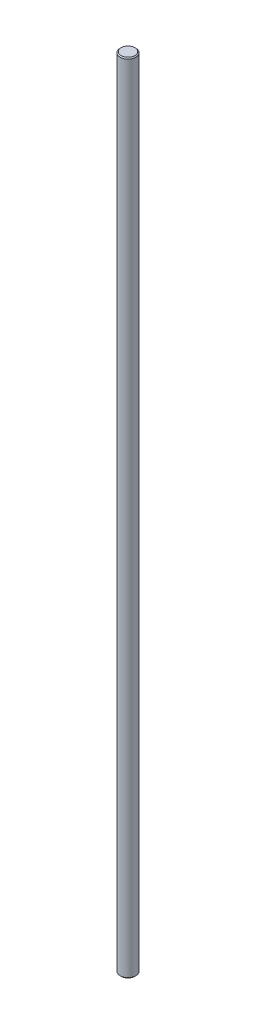
ISO-10303-21;
HEADER;
FILE_DESCRIPTION(('STEP AP214'),'2;1');
FILE_NAME('part.step','',(''),(''),'','','');
FILE_SCHEMA(('AUTOMOTIVE_DESIGN { 1 0 10303 214 1 1 1 1 }'));
ENDSEC;
DATA;
#1=APPLICATION_CONTEXT('core data for automotive mechanical design processes');
#2=APPLICATION_PROTOCOL_DEFINITION('international standard','automotive_design',2000,#1);
#3=PRODUCT_CONTEXT('',#1,'mechanical');
#4=PRODUCT('Part','Part','',(#3));
#5=PRODUCT_RELATED_PRODUCT_CATEGORY('part','',(#4));
#6=PRODUCT_DEFINITION_FORMATION('','',#4);
#7=PRODUCT_DEFINITION_CONTEXT('part definition',#1,'design');
#8=PRODUCT_DEFINITION('design','',#6,#7);
#9=PRODUCT_DEFINITION_SHAPE('','',#8);
#10=(LENGTH_UNIT() NAMED_UNIT(*) SI_UNIT(.MILLI.,.METRE.));
#11=(NAMED_UNIT(*) PLANE_ANGLE_UNIT() SI_UNIT($,.RADIAN.));
#12=(NAMED_UNIT(*) SI_UNIT($,.STERADIAN.) SOLID_ANGLE_UNIT());
#13=UNCERTAINTY_MEASURE_WITH_UNIT(LENGTH_MEASURE(1.E-05),#10,'distance_accuracy_value','');
#14=(GEOMETRIC_REPRESENTATION_CONTEXT(3) GLOBAL_UNCERTAINTY_ASSIGNED_CONTEXT((#13)) GLOBAL_UNIT_ASSIGNED_CONTEXT((#10,
#11,#12)) REPRESENTATION_CONTEXT('',''));
#15=CARTESIAN_POINT('',(0.,0.,0.));
#16=DIRECTION('',(0.,0.,1.));
#17=DIRECTION('',(1.,0.,0.));
#18=AXIS2_PLACEMENT_3D('',#15,#16,#17);
#19=CARTESIAN_POINT('',(0.,405.5,0.));
#20=DIRECTION('',(0.,-1.,0.));
#21=DIRECTION('',(0.,0.,-1.));
#22=AXIS2_PLACEMENT_3D('',#19,#20,#21);
#23=CONICAL_SURFACE('',#22,4.,0.785398163397447);
#24=CARTESIAN_POINT('',(0.,406.,0.));
#25=DIRECTION('',(0.,-1.,0.));
#26=DIRECTION('',(0.,0.,-1.));
#27=AXIS2_PLACEMENT_3D('',#24,#25,#26);
#28=CIRCLE('',#27,3.5);
#29=CARTESIAN_POINT('',(0.,406.,-3.5));
#30=VERTEX_POINT('',#29);
#31=EDGE_CURVE('E42',#30,#30,#28,.T.);
#32=ORIENTED_EDGE('',*,*,#31,.T.);
#33=EDGE_LOOP('',(#32));
#34=FACE_BOUND('',#33,.T.);
#35=CARTESIAN_POINT('',(0.,405.5,0.));
#36=DIRECTION('',(0.,-1.,0.));
#37=DIRECTION('',(0.,0.,-1.));
#38=AXIS2_PLACEMENT_3D('',#35,#36,#37);
#39=CIRCLE('',#38,4.);
#40=CARTESIAN_POINT('',(0.,405.5,-4.));
#41=VERTEX_POINT('',#40);
#42=EDGE_CURVE('E10',#41,#41,#39,.T.);
#43=ORIENTED_EDGE('',*,*,#42,.F.);
#44=EDGE_LOOP('',(#43));
#45=FACE_BOUND('',#44,.T.);
#46=ADVANCED_FACE('F28',(#34,#45),#23,.T.);
#47=CARTESIAN_POINT('',(0.,406.,0.));
#48=DIRECTION('',(0.,-1.,0.));
#49=DIRECTION('',(0.,0.,-1.));
#50=AXIS2_PLACEMENT_3D('',#47,#48,#49);
#51=CYLINDRICAL_SURFACE('',#50,4.);
#52=ORIENTED_EDGE('',*,*,#42,.T.);
#53=EDGE_LOOP('',(#52));
#54=FACE_BOUND('',#53,.T.);
#55=CARTESIAN_POINT('',(0.,0.5,0.));
#56=DIRECTION('',(0.,-1.,0.));
#57=DIRECTION('',(0.,0.,-1.));
#58=AXIS2_PLACEMENT_3D('',#55,#56,#57);
#59=CIRCLE('',#58,4.);
#60=CARTESIAN_POINT('',(0.,0.5,-4.));
#61=VERTEX_POINT('',#60);
#62=EDGE_CURVE('E34',#61,#61,#59,.T.);
#63=ORIENTED_EDGE('',*,*,#62,.F.);
#64=EDGE_LOOP('',(#63));
#65=FACE_BOUND('',#64,.T.);
#66=ADVANCED_FACE('F61',(#54,#65),#51,.T.);
#67=CARTESIAN_POINT('',(0.,0.,0.));
#68=DIRECTION('',(0.,1.,0.));
#69=DIRECTION('',(0.,0.,1.));
#70=AXIS2_PLACEMENT_3D('',#67,#68,#69);
#71=CONICAL_SURFACE('',#70,3.5,0.785398163397448);
#72=ORIENTED_EDGE('',*,*,#62,.T.);
#73=EDGE_LOOP('',(#72));
#74=FACE_BOUND('',#73,.T.);
#75=CARTESIAN_POINT('',(0.,0.,0.));
#76=DIRECTION('',(0.,-1.,0.));
#77=DIRECTION('',(0.,0.,-1.));
#78=AXIS2_PLACEMENT_3D('',#75,#76,#77);
#79=CIRCLE('',#78,3.5);
#80=CARTESIAN_POINT('',(0.,0.,-3.5));
#81=VERTEX_POINT('',#80);
#82=EDGE_CURVE('E38',#81,#81,#79,.T.);
#83=ORIENTED_EDGE('',*,*,#82,.F.);
#84=EDGE_LOOP('',(#83));
#85=FACE_BOUND('',#84,.T.);
#86=ADVANCED_FACE('F57',(#74,#85),#71,.T.);
#87=CARTESIAN_POINT('',(0.,0.,0.));
#88=DIRECTION('',(0.,-1.,0.));
#89=DIRECTION('',(0.,0.,-1.));
#90=AXIS2_PLACEMENT_3D('',#87,#88,#89);
#91=PLANE('',#90);
#92=ORIENTED_EDGE('',*,*,#82,.T.);
#93=EDGE_LOOP('',(#92));
#94=FACE_BOUND('',#93,.T.);
#95=ADVANCED_FACE('F52',(#94),#91,.T.);
#96=CARTESIAN_POINT('',(3.5,406.,0.));
#97=DIRECTION('',(0.,1.,0.));
#98=DIRECTION('',(0.,0.,1.));
#99=AXIS2_PLACEMENT_3D('',#96,#97,#98);
#100=PLANE('',#99);
#101=ORIENTED_EDGE('',*,*,#31,.F.);
#102=EDGE_LOOP('',(#101));
#103=FACE_BOUND('',#102,.T.);
#104=ADVANCED_FACE('F50',(#103),#100,.T.);
#105=CLOSED_SHELL('',(#46,#66,#86,#95,#104));
#106=MANIFOLD_SOLID_BREP('B2',#105);
#107=ADVANCED_BREP_SHAPE_REPRESENTATION('',(#18,#106),#14);
#108=SHAPE_DEFINITION_REPRESENTATION(#9,#107);
ENDSEC;
END-ISO-10303-21;
